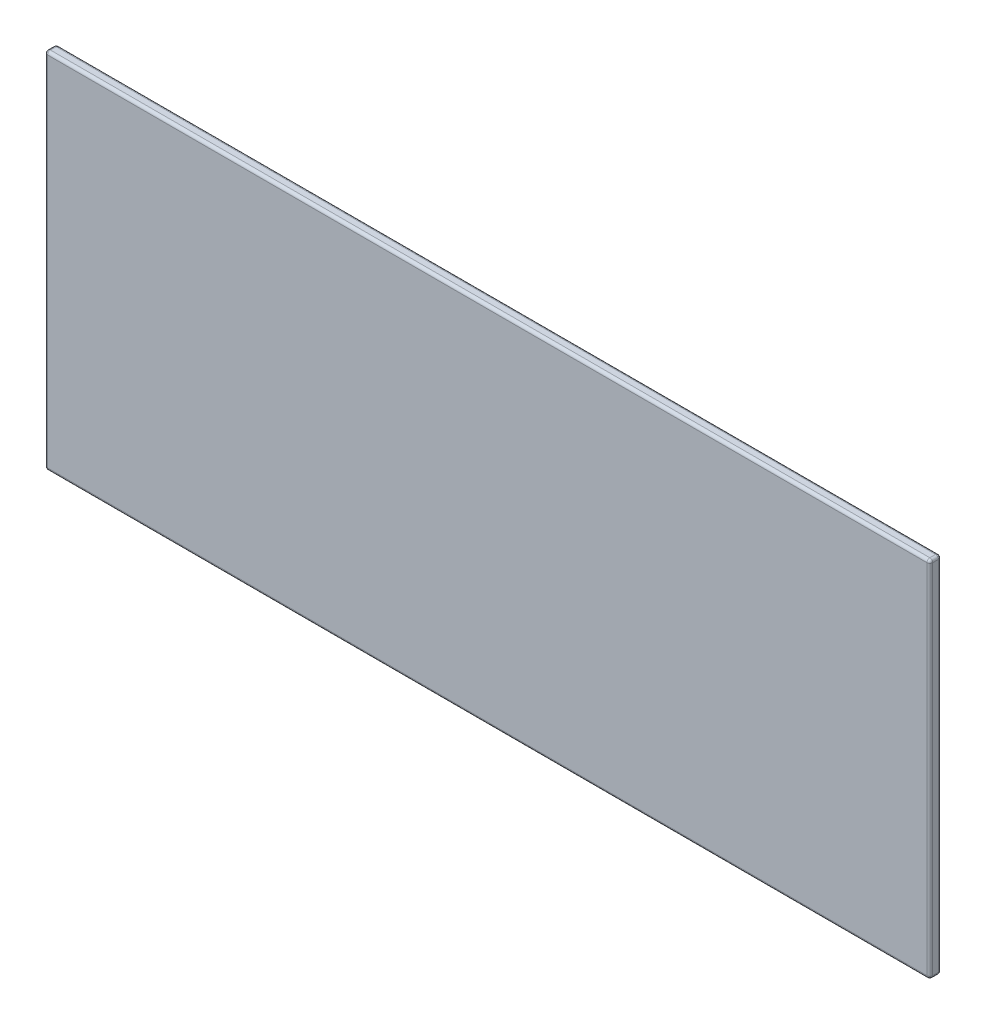
ISO-10303-21;
HEADER;
FILE_DESCRIPTION(('STEP AP214'),'2;1');
FILE_NAME('part.step','',(''),(''),'','','');
FILE_SCHEMA(('AUTOMOTIVE_DESIGN { 1 0 10303 214 1 1 1 1 }'));
ENDSEC;
DATA;
#1=APPLICATION_CONTEXT('core data for automotive mechanical design processes');
#2=APPLICATION_PROTOCOL_DEFINITION('international standard','automotive_design',2000,#1);
#3=PRODUCT_CONTEXT('',#1,'mechanical');
#4=PRODUCT('Part','Part','',(#3));
#5=PRODUCT_RELATED_PRODUCT_CATEGORY('part','',(#4));
#6=PRODUCT_DEFINITION_FORMATION('','',#4);
#7=PRODUCT_DEFINITION_CONTEXT('part definition',#1,'design');
#8=PRODUCT_DEFINITION('design','',#6,#7);
#9=PRODUCT_DEFINITION_SHAPE('','',#8);
#10=(LENGTH_UNIT() NAMED_UNIT(*) SI_UNIT(.MILLI.,.METRE.));
#11=(NAMED_UNIT(*) PLANE_ANGLE_UNIT() SI_UNIT($,.RADIAN.));
#12=(NAMED_UNIT(*) SI_UNIT($,.STERADIAN.) SOLID_ANGLE_UNIT());
#13=UNCERTAINTY_MEASURE_WITH_UNIT(LENGTH_MEASURE(1.E-05),#10,'distance_accuracy_value','');
#14=(GEOMETRIC_REPRESENTATION_CONTEXT(3) GLOBAL_UNCERTAINTY_ASSIGNED_CONTEXT((#13)) GLOBAL_UNIT_ASSIGNED_CONTEXT((#10,
#11,#12)) REPRESENTATION_CONTEXT('',''));
#15=CARTESIAN_POINT('',(0.,0.,0.));
#16=DIRECTION('',(0.,0.,1.));
#17=DIRECTION('',(1.,0.,0.));
#18=AXIS2_PLACEMENT_3D('',#15,#16,#17);
#19=CARTESIAN_POINT('',(77.35,-31.75,2.));
#20=DIRECTION('',(-1.,0.,0.));
#21=DIRECTION('',(0.,0.,1.));
#22=AXIS2_PLACEMENT_3D('',#19,#20,#21);
#23=PLANE('',#22);
#24=DIRECTION('',(0.,1.,0.));
#25=VECTOR('',#24,1.);
#26=CARTESIAN_POINT('',(77.35,-31.75,1.5));
#27=LINE('',#26,#25);
#28=CARTESIAN_POINT('',(77.35,31.25,1.5));
#29=VERTEX_POINT('',#28);
#30=CARTESIAN_POINT('',(77.35,-31.25,1.5));
#31=VERTEX_POINT('',#30);
#32=EDGE_CURVE('E42',#29,#31,#27,.F.);
#33=ORIENTED_EDGE('',*,*,#32,.T.);
#34=DIRECTION('',(0.,0.,-1.));
#35=VECTOR('',#34,1.);
#36=CARTESIAN_POINT('',(77.35,-31.25,2.));
#37=LINE('',#36,#35);
#38=CARTESIAN_POINT('',(77.35,-31.25,0.5));
#39=VERTEX_POINT('',#38);
#40=EDGE_CURVE('E11',#31,#39,#37,.T.);
#41=ORIENTED_EDGE('',*,*,#40,.T.);
#42=DIRECTION('',(0.,1.,0.));
#43=VECTOR('',#42,1.);
#44=CARTESIAN_POINT('',(77.35,31.75,0.5));
#45=LINE('',#44,#43);
#46=CARTESIAN_POINT('',(77.35,31.25,0.5));
#47=VERTEX_POINT('',#46);
#48=EDGE_CURVE('E194',#39,#47,#45,.T.);
#49=ORIENTED_EDGE('',*,*,#48,.T.);
#50=DIRECTION('',(0.,0.,-1.));
#51=VECTOR('',#50,1.);
#52=CARTESIAN_POINT('',(77.35,31.25,2.));
#53=LINE('',#52,#51);
#54=EDGE_CURVE('E53',#47,#29,#53,.F.);
#55=ORIENTED_EDGE('',*,*,#54,.T.);
#56=EDGE_LOOP('',(#33,#41,#49,#55));
#57=FACE_BOUND('',#56,.T.);
#58=ADVANCED_FACE('F33',(#57),#23,.F.);
#59=CARTESIAN_POINT('',(-77.35,31.75,2.));
#60=DIRECTION('',(0.,-1.,0.));
#61=DIRECTION('',(0.,0.,-1.));
#62=AXIS2_PLACEMENT_3D('',#59,#60,#61);
#63=PLANE('',#62);
#64=DIRECTION('',(0.,0.,-1.));
#65=VECTOR('',#64,1.);
#66=CARTESIAN_POINT('',(-76.85,31.75,2.));
#67=LINE('',#66,#65);
#68=CARTESIAN_POINT('',(-76.85,31.75,0.5));
#69=VERTEX_POINT('',#68);
#70=CARTESIAN_POINT('',(-76.85,31.75,1.5));
#71=VERTEX_POINT('',#70);
#72=EDGE_CURVE('E189',#69,#71,#67,.F.);
#73=ORIENTED_EDGE('',*,*,#72,.T.);
#74=DIRECTION('',(-1.,0.,0.));
#75=VECTOR('',#74,1.);
#76=CARTESIAN_POINT('',(-77.35,31.75,1.5));
#77=LINE('',#76,#75);
#78=CARTESIAN_POINT('',(76.85,31.75,1.5));
#79=VERTEX_POINT('',#78);
#80=EDGE_CURVE('E191',#71,#79,#77,.F.);
#81=ORIENTED_EDGE('',*,*,#80,.T.);
#82=DIRECTION('',(0.,0.,-1.));
#83=VECTOR('',#82,1.);
#84=CARTESIAN_POINT('',(76.85,31.75,2.));
#85=LINE('',#84,#83);
#86=CARTESIAN_POINT('',(76.85,31.75,0.5));
#87=VERTEX_POINT('',#86);
#88=EDGE_CURVE('E185',#79,#87,#85,.T.);
#89=ORIENTED_EDGE('',*,*,#88,.T.);
#90=DIRECTION('',(-1.,0.,0.));
#91=VECTOR('',#90,1.);
#92=CARTESIAN_POINT('',(-77.35,31.75,0.5));
#93=LINE('',#92,#91);
#94=EDGE_CURVE('E187',#87,#69,#93,.T.);
#95=ORIENTED_EDGE('',*,*,#94,.T.);
#96=EDGE_LOOP('',(#73,#81,#89,#95));
#97=FACE_BOUND('',#96,.T.);
#98=ADVANCED_FACE('F278',(#97),#63,.F.);
#99=CARTESIAN_POINT('',(-77.35,-31.75,2.));
#100=DIRECTION('',(1.,0.,0.));
#101=DIRECTION('',(0.,0.,-1.));
#102=AXIS2_PLACEMENT_3D('',#99,#100,#101);
#103=PLANE('',#102);
#104=DIRECTION('',(0.,0.,-1.));
#105=VECTOR('',#104,1.);
#106=CARTESIAN_POINT('',(-77.35,-31.25,2.));
#107=LINE('',#106,#105);
#108=CARTESIAN_POINT('',(-77.35,-31.25,0.5));
#109=VERTEX_POINT('',#108);
#110=CARTESIAN_POINT('',(-77.35,-31.25,1.5));
#111=VERTEX_POINT('',#110);
#112=EDGE_CURVE('E180',#109,#111,#107,.F.);
#113=ORIENTED_EDGE('',*,*,#112,.T.);
#114=DIRECTION('',(0.,-1.,0.));
#115=VECTOR('',#114,1.);
#116=CARTESIAN_POINT('',(-77.35,-31.75,1.5));
#117=LINE('',#116,#115);
#118=CARTESIAN_POINT('',(-77.35,31.25,1.5));
#119=VERTEX_POINT('',#118);
#120=EDGE_CURVE('E182',#111,#119,#117,.F.);
#121=ORIENTED_EDGE('',*,*,#120,.T.);
#122=DIRECTION('',(0.,0.,-1.));
#123=VECTOR('',#122,1.);
#124=CARTESIAN_POINT('',(-77.35,31.25,2.));
#125=LINE('',#124,#123);
#126=CARTESIAN_POINT('',(-77.35,31.25,0.5));
#127=VERTEX_POINT('',#126);
#128=EDGE_CURVE('E176',#119,#127,#125,.T.);
#129=ORIENTED_EDGE('',*,*,#128,.T.);
#130=DIRECTION('',(0.,-1.,0.));
#131=VECTOR('',#130,1.);
#132=CARTESIAN_POINT('',(-77.35,-31.75,0.5));
#133=LINE('',#132,#131);
#134=EDGE_CURVE('E178',#127,#109,#133,.T.);
#135=ORIENTED_EDGE('',*,*,#134,.T.);
#136=EDGE_LOOP('',(#113,#121,#129,#135));
#137=FACE_BOUND('',#136,.T.);
#138=ADVANCED_FACE('F269',(#137),#103,.F.);
#139=CARTESIAN_POINT('',(-77.35,-31.75,2.));
#140=DIRECTION('',(0.,1.,0.));
#141=DIRECTION('',(0.,0.,1.));
#142=AXIS2_PLACEMENT_3D('',#139,#140,#141);
#143=PLANE('',#142);
#144=DIRECTION('',(1.,0.,0.));
#145=VECTOR('',#144,1.);
#146=CARTESIAN_POINT('',(-77.35,-31.75,1.5));
#147=LINE('',#146,#145);
#148=CARTESIAN_POINT('',(76.85,-31.75,1.5));
#149=VERTEX_POINT('',#148);
#150=CARTESIAN_POINT('',(-76.85,-31.75,1.5));
#151=VERTEX_POINT('',#150);
#152=EDGE_CURVE('E129',#149,#151,#147,.F.);
#153=ORIENTED_EDGE('',*,*,#152,.T.);
#154=DIRECTION('',(0.,0.,-1.));
#155=VECTOR('',#154,1.);
#156=CARTESIAN_POINT('',(-76.85,-31.75,2.));
#157=LINE('',#156,#155);
#158=CARTESIAN_POINT('',(-76.85,-31.75,0.5));
#159=VERTEX_POINT('',#158);
#160=EDGE_CURVE('E165',#151,#159,#157,.T.);
#161=ORIENTED_EDGE('',*,*,#160,.T.);
#162=DIRECTION('',(1.,0.,0.));
#163=VECTOR('',#162,1.);
#164=CARTESIAN_POINT('',(77.35,-31.75,0.5));
#165=LINE('',#164,#163);
#166=CARTESIAN_POINT('',(76.85,-31.75,0.5));
#167=VERTEX_POINT('',#166);
#168=EDGE_CURVE('E158',#159,#167,#165,.T.);
#169=ORIENTED_EDGE('',*,*,#168,.T.);
#170=DIRECTION('',(0.,0.,-1.));
#171=VECTOR('',#170,1.);
#172=CARTESIAN_POINT('',(76.85,-31.75,2.));
#173=LINE('',#172,#171);
#174=EDGE_CURVE('E156',#167,#149,#173,.F.);
#175=ORIENTED_EDGE('',*,*,#174,.T.);
#176=EDGE_LOOP('',(#153,#161,#169,#175));
#177=FACE_BOUND('',#176,.T.);
#178=ADVANCED_FACE('F356',(#177),#143,.F.);
#179=CARTESIAN_POINT('',(0.,0.,2.));
#180=DIRECTION('',(0.,0.,-1.));
#181=DIRECTION('',(-1.,0.,0.));
#182=AXIS2_PLACEMENT_3D('',#179,#180,#181);
#183=PLANE('',#182);
#184=DIRECTION('',(0.,-1.,0.));
#185=VECTOR('',#184,1.);
#186=CARTESIAN_POINT('',(-76.85,0.,2.));
#187=LINE('',#186,#185);
#188=CARTESIAN_POINT('',(-76.85,31.25,2.));
#189=VERTEX_POINT('',#188);
#190=CARTESIAN_POINT('',(-76.85,-31.25,2.));
#191=VERTEX_POINT('',#190);
#192=EDGE_CURVE('E154',#189,#191,#187,.T.);
#193=ORIENTED_EDGE('',*,*,#192,.T.);
#194=DIRECTION('',(1.,0.,0.));
#195=VECTOR('',#194,1.);
#196=CARTESIAN_POINT('',(0.,-31.25,2.));
#197=LINE('',#196,#195);
#198=CARTESIAN_POINT('',(76.85,-31.25,2.));
#199=VERTEX_POINT('',#198);
#200=EDGE_CURVE('E127',#191,#199,#197,.T.);
#201=ORIENTED_EDGE('',*,*,#200,.T.);
#202=DIRECTION('',(0.,1.,0.));
#203=VECTOR('',#202,1.);
#204=CARTESIAN_POINT('',(76.85,0.,2.));
#205=LINE('',#204,#203);
#206=CARTESIAN_POINT('',(76.85,31.25,2.));
#207=VERTEX_POINT('',#206);
#208=EDGE_CURVE('E144',#199,#207,#205,.T.);
#209=ORIENTED_EDGE('',*,*,#208,.T.);
#210=DIRECTION('',(-1.,0.,0.));
#211=VECTOR('',#210,1.);
#212=CARTESIAN_POINT('',(0.,31.25,2.));
#213=LINE('',#212,#211);
#214=EDGE_CURVE('E150',#207,#189,#213,.T.);
#215=ORIENTED_EDGE('',*,*,#214,.T.);
#216=EDGE_LOOP('',(#193,#201,#209,#215));
#217=FACE_BOUND('',#216,.T.);
#218=ADVANCED_FACE('F152',(#217),#183,.F.);
#219=CARTESIAN_POINT('',(0.,0.,0.));
#220=DIRECTION('',(0.,0.,-1.));
#221=DIRECTION('',(-1.,0.,0.));
#222=AXIS2_PLACEMENT_3D('',#219,#220,#221);
#223=PLANE('',#222);
#224=DIRECTION('',(0.,1.,0.));
#225=VECTOR('',#224,1.);
#226=CARTESIAN_POINT('',(76.85,-31.75,0.));
#227=LINE('',#226,#225);
#228=CARTESIAN_POINT('',(76.85,31.25,0.));
#229=VERTEX_POINT('',#228);
#230=CARTESIAN_POINT('',(76.85,-31.25,0.));
#231=VERTEX_POINT('',#230);
#232=EDGE_CURVE('E167',#229,#231,#227,.F.);
#233=ORIENTED_EDGE('',*,*,#232,.T.);
#234=DIRECTION('',(1.,0.,0.));
#235=VECTOR('',#234,1.);
#236=CARTESIAN_POINT('',(-77.35,-31.25,0.));
#237=LINE('',#236,#235);
#238=CARTESIAN_POINT('',(-76.85,-31.25,0.));
#239=VERTEX_POINT('',#238);
#240=EDGE_CURVE('E173',#231,#239,#237,.F.);
#241=ORIENTED_EDGE('',*,*,#240,.T.);
#242=DIRECTION('',(0.,-1.,0.));
#243=VECTOR('',#242,1.);
#244=CARTESIAN_POINT('',(-76.85,31.75,0.));
#245=LINE('',#244,#243);
#246=CARTESIAN_POINT('',(-76.85,31.25,0.));
#247=VERTEX_POINT('',#246);
#248=EDGE_CURVE('E171',#239,#247,#245,.F.);
#249=ORIENTED_EDGE('',*,*,#248,.T.);
#250=DIRECTION('',(-1.,0.,0.));
#251=VECTOR('',#250,1.);
#252=CARTESIAN_POINT('',(77.35,31.25,0.));
#253=LINE('',#252,#251);
#254=EDGE_CURVE('E169',#247,#229,#253,.F.);
#255=ORIENTED_EDGE('',*,*,#254,.T.);
#256=EDGE_LOOP('',(#233,#241,#249,#255));
#257=FACE_BOUND('',#256,.T.);
#258=ADVANCED_FACE('F296',(#257),#223,.T.);
#259=CARTESIAN_POINT('',(-77.35,31.25,0.5));
#260=DIRECTION('',(1.,0.,0.));
#261=DIRECTION('',(0.,0.,-1.));
#262=AXIS2_PLACEMENT_3D('',#259,#260,#261);
#263=CYLINDRICAL_SURFACE('',#262,0.5);
#264=CARTESIAN_POINT('',(-76.85,31.25,0.5));
#265=DIRECTION('',(-1.,0.,0.));
#266=DIRECTION('',(0.,0.,1.));
#267=AXIS2_PLACEMENT_3D('',#264,#265,#266);
#268=CIRCLE('',#267,0.5);
#269=EDGE_CURVE('E37',#69,#247,#268,.T.);
#270=ORIENTED_EDGE('',*,*,#269,.F.);
#271=ORIENTED_EDGE('',*,*,#94,.F.);
#272=CARTESIAN_POINT('',(76.85,31.25,0.5));
#273=DIRECTION('',(1.,0.,0.));
#274=DIRECTION('',(0.,0.,-1.));
#275=AXIS2_PLACEMENT_3D('',#272,#273,#274);
#276=CIRCLE('',#275,0.5);
#277=EDGE_CURVE('E246',#229,#87,#276,.T.);
#278=ORIENTED_EDGE('',*,*,#277,.F.);
#279=ORIENTED_EDGE('',*,*,#254,.F.);
#280=EDGE_LOOP('',(#270,#271,#278,#279));
#281=FACE_BOUND('',#280,.T.);
#282=ADVANCED_FACE('F35',(#281),#263,.T.);
#283=CARTESIAN_POINT('',(-76.85,31.25,0.5));
#284=DIRECTION('',(0.,0.,1.));
#285=DIRECTION('',(1.,0.,0.));
#286=AXIS2_PLACEMENT_3D('',#283,#284,#285);
#287=SPHERICAL_SURFACE('',#286,0.5);
#288=CARTESIAN_POINT('',(-76.85,31.25,0.5));
#289=DIRECTION('',(0.,0.,-1.));
#290=DIRECTION('',(-1.,0.,0.));
#291=AXIS2_PLACEMENT_3D('',#288,#289,#290);
#292=CIRCLE('',#291,0.5);
#293=EDGE_CURVE('E241',#69,#127,#292,.F.);
#294=ORIENTED_EDGE('',*,*,#293,.F.);
#295=ORIENTED_EDGE('',*,*,#269,.T.);
#296=CARTESIAN_POINT('',(-76.85,31.25,0.5));
#297=DIRECTION('',(0.,1.,0.));
#298=DIRECTION('',(0.,0.,1.));
#299=AXIS2_PLACEMENT_3D('',#296,#297,#298);
#300=CIRCLE('',#299,0.5);
#301=EDGE_CURVE('E244',#127,#247,#300,.F.);
#302=ORIENTED_EDGE('',*,*,#301,.F.);
#303=EDGE_LOOP('',(#294,#295,#302));
#304=FACE_BOUND('',#303,.T.);
#305=ADVANCED_FACE('F257',(#304),#287,.T.);
#306=CARTESIAN_POINT('',(76.85,31.25,0.5));
#307=DIRECTION('',(0.,0.,1.));
#308=DIRECTION('',(1.,0.,0.));
#309=AXIS2_PLACEMENT_3D('',#306,#307,#308);
#310=SPHERICAL_SURFACE('',#309,0.5);
#311=CARTESIAN_POINT('',(76.85,31.25,0.5));
#312=DIRECTION('',(0.,1.,0.));
#313=DIRECTION('',(0.,0.,1.));
#314=AXIS2_PLACEMENT_3D('',#311,#312,#313);
#315=CIRCLE('',#314,0.5);
#316=EDGE_CURVE('E235',#229,#47,#315,.F.);
#317=ORIENTED_EDGE('',*,*,#316,.F.);
#318=ORIENTED_EDGE('',*,*,#277,.T.);
#319=CARTESIAN_POINT('',(76.85,31.25,0.5));
#320=DIRECTION('',(0.,0.,-1.));
#321=DIRECTION('',(-1.,0.,0.));
#322=AXIS2_PLACEMENT_3D('',#319,#320,#321);
#323=CIRCLE('',#322,0.5);
#324=EDGE_CURVE('E238',#47,#87,#323,.F.);
#325=ORIENTED_EDGE('',*,*,#324,.F.);
#326=EDGE_LOOP('',(#317,#318,#325));
#327=FACE_BOUND('',#326,.T.);
#328=ADVANCED_FACE('F289',(#327),#310,.T.);
#329=CARTESIAN_POINT('',(-76.85,-31.75,0.5));
#330=DIRECTION('',(0.,1.,0.));
#331=DIRECTION('',(0.,0.,1.));
#332=AXIS2_PLACEMENT_3D('',#329,#330,#331);
#333=CYLINDRICAL_SURFACE('',#332,0.5);
#334=ORIENTED_EDGE('',*,*,#301,.T.);
#335=ORIENTED_EDGE('',*,*,#248,.F.);
#336=CARTESIAN_POINT('',(-76.85,-31.25,0.5));
#337=DIRECTION('',(0.,-1.,0.));
#338=DIRECTION('',(0.,0.,-1.));
#339=AXIS2_PLACEMENT_3D('',#336,#337,#338);
#340=CIRCLE('',#339,0.5);
#341=EDGE_CURVE('E230',#109,#239,#340,.T.);
#342=ORIENTED_EDGE('',*,*,#341,.F.);
#343=ORIENTED_EDGE('',*,*,#134,.F.);
#344=EDGE_LOOP('',(#334,#335,#342,#343));
#345=FACE_BOUND('',#344,.T.);
#346=ADVANCED_FACE('F265',(#345),#333,.T.);
#347=CARTESIAN_POINT('',(-76.85,31.25,2.));
#348=DIRECTION('',(0.,0.,-1.));
#349=DIRECTION('',(-1.,0.,0.));
#350=AXIS2_PLACEMENT_3D('',#347,#348,#349);
#351=CYLINDRICAL_SURFACE('',#350,0.5);
#352=ORIENTED_EDGE('',*,*,#293,.T.);
#353=ORIENTED_EDGE('',*,*,#128,.F.);
#354=CARTESIAN_POINT('',(-76.85,31.25,1.5));
#355=DIRECTION('',(0.,0.,1.));
#356=DIRECTION('',(1.,0.,0.));
#357=AXIS2_PLACEMENT_3D('',#354,#355,#356);
#358=CIRCLE('',#357,0.5);
#359=EDGE_CURVE('E227',#71,#119,#358,.T.);
#360=ORIENTED_EDGE('',*,*,#359,.F.);
#361=ORIENTED_EDGE('',*,*,#72,.F.);
#362=EDGE_LOOP('',(#352,#353,#360,#361));
#363=FACE_BOUND('',#362,.T.);
#364=ADVANCED_FACE('F275',(#363),#351,.T.);
#365=CARTESIAN_POINT('',(0.,31.25,1.5));
#366=DIRECTION('',(-1.,0.,0.));
#367=DIRECTION('',(0.,0.,1.));
#368=AXIS2_PLACEMENT_3D('',#365,#366,#367);
#369=CYLINDRICAL_SURFACE('',#368,0.5);
#370=CARTESIAN_POINT('',(76.85,31.25,1.5));
#371=DIRECTION('',(1.,0.,0.));
#372=DIRECTION('',(0.,0.,-1.));
#373=AXIS2_PLACEMENT_3D('',#370,#371,#372);
#374=CIRCLE('',#373,0.5);
#375=EDGE_CURVE('E221',#79,#207,#374,.T.);
#376=ORIENTED_EDGE('',*,*,#375,.F.);
#377=ORIENTED_EDGE('',*,*,#80,.F.);
#378=CARTESIAN_POINT('',(-76.85,31.25,1.5));
#379=DIRECTION('',(-1.,0.,0.));
#380=DIRECTION('',(0.,0.,1.));
#381=AXIS2_PLACEMENT_3D('',#378,#379,#380);
#382=CIRCLE('',#381,0.5);
#383=EDGE_CURVE('E224',#189,#71,#382,.T.);
#384=ORIENTED_EDGE('',*,*,#383,.F.);
#385=ORIENTED_EDGE('',*,*,#214,.F.);
#386=EDGE_LOOP('',(#376,#377,#384,#385));
#387=FACE_BOUND('',#386,.T.);
#388=ADVANCED_FACE('F282',(#387),#369,.T.);
#389=CARTESIAN_POINT('',(76.85,31.25,2.));
#390=DIRECTION('',(0.,0.,-1.));
#391=DIRECTION('',(-1.,0.,0.));
#392=AXIS2_PLACEMENT_3D('',#389,#390,#391);
#393=CYLINDRICAL_SURFACE('',#392,0.5);
#394=ORIENTED_EDGE('',*,*,#324,.T.);
#395=ORIENTED_EDGE('',*,*,#88,.F.);
#396=CARTESIAN_POINT('',(76.85,31.25,1.5));
#397=DIRECTION('',(0.,0.,1.));
#398=DIRECTION('',(1.,0.,0.));
#399=AXIS2_PLACEMENT_3D('',#396,#397,#398);
#400=CIRCLE('',#399,0.5);
#401=EDGE_CURVE('E219',#29,#79,#400,.T.);
#402=ORIENTED_EDGE('',*,*,#401,.F.);
#403=ORIENTED_EDGE('',*,*,#54,.F.);
#404=EDGE_LOOP('',(#394,#395,#402,#403));
#405=FACE_BOUND('',#404,.T.);
#406=ADVANCED_FACE('F287',(#405),#393,.T.);
#407=CARTESIAN_POINT('',(76.85,-31.75,0.5));
#408=DIRECTION('',(0.,-1.,0.));
#409=DIRECTION('',(0.,0.,-1.));
#410=AXIS2_PLACEMENT_3D('',#407,#408,#409);
#411=CYLINDRICAL_SURFACE('',#410,0.5);
#412=ORIENTED_EDGE('',*,*,#316,.T.);
#413=ORIENTED_EDGE('',*,*,#48,.F.);
#414=CARTESIAN_POINT('',(76.85,-31.25,0.5));
#415=DIRECTION('',(0.,-1.,0.));
#416=DIRECTION('',(0.,0.,-1.));
#417=AXIS2_PLACEMENT_3D('',#414,#415,#416);
#418=CIRCLE('',#417,0.5);
#419=EDGE_CURVE('E216',#231,#39,#418,.T.);
#420=ORIENTED_EDGE('',*,*,#419,.F.);
#421=ORIENTED_EDGE('',*,*,#232,.F.);
#422=EDGE_LOOP('',(#412,#413,#420,#421));
#423=FACE_BOUND('',#422,.T.);
#424=ADVANCED_FACE('F293',(#423),#411,.T.);
#425=CARTESIAN_POINT('',(-77.35,-31.25,0.5));
#426=DIRECTION('',(-1.,0.,0.));
#427=DIRECTION('',(0.,0.,1.));
#428=AXIS2_PLACEMENT_3D('',#425,#426,#427);
#429=CYLINDRICAL_SURFACE('',#428,0.5);
#430=CARTESIAN_POINT('',(-76.85,-31.25,0.5));
#431=DIRECTION('',(-1.,0.,0.));
#432=DIRECTION('',(0.,0.,1.));
#433=AXIS2_PLACEMENT_3D('',#430,#431,#432);
#434=CIRCLE('',#433,0.5);
#435=EDGE_CURVE('E232',#239,#159,#434,.T.);
#436=ORIENTED_EDGE('',*,*,#435,.F.);
#437=ORIENTED_EDGE('',*,*,#240,.F.);
#438=CARTESIAN_POINT('',(76.85,-31.25,0.5));
#439=DIRECTION('',(1.,0.,0.));
#440=DIRECTION('',(0.,0.,-1.));
#441=AXIS2_PLACEMENT_3D('',#438,#439,#440);
#442=CIRCLE('',#441,0.5);
#443=EDGE_CURVE('E213',#167,#231,#442,.T.);
#444=ORIENTED_EDGE('',*,*,#443,.F.);
#445=ORIENTED_EDGE('',*,*,#168,.F.);
#446=EDGE_LOOP('',(#436,#437,#444,#445));
#447=FACE_BOUND('',#446,.T.);
#448=ADVANCED_FACE('F300',(#447),#429,.T.);
#449=CARTESIAN_POINT('',(-76.85,-31.25,0.5));
#450=DIRECTION('',(0.,0.,1.));
#451=DIRECTION('',(1.,0.,0.));
#452=AXIS2_PLACEMENT_3D('',#449,#450,#451);
#453=SPHERICAL_SURFACE('',#452,0.5);
#454=ORIENTED_EDGE('',*,*,#341,.T.);
#455=ORIENTED_EDGE('',*,*,#435,.T.);
#456=CARTESIAN_POINT('',(-76.85,-31.25,0.5));
#457=DIRECTION('',(0.,0.,-1.));
#458=DIRECTION('',(-1.,0.,0.));
#459=AXIS2_PLACEMENT_3D('',#456,#457,#458);
#460=CIRCLE('',#459,0.5);
#461=EDGE_CURVE('E210',#109,#159,#460,.F.);
#462=ORIENTED_EDGE('',*,*,#461,.F.);
#463=EDGE_LOOP('',(#454,#455,#462));
#464=FACE_BOUND('',#463,.T.);
#465=ADVANCED_FACE('F304',(#464),#453,.T.);
#466=CARTESIAN_POINT('',(-76.85,31.25,1.5));
#467=DIRECTION('',(0.,0.,1.));
#468=DIRECTION('',(1.,0.,0.));
#469=AXIS2_PLACEMENT_3D('',#466,#467,#468);
#470=SPHERICAL_SURFACE('',#469,0.5);
#471=ORIENTED_EDGE('',*,*,#383,.T.);
#472=ORIENTED_EDGE('',*,*,#359,.T.);
#473=CARTESIAN_POINT('',(-76.85,31.25,1.5));
#474=DIRECTION('',(0.,1.,0.));
#475=DIRECTION('',(0.,0.,1.));
#476=AXIS2_PLACEMENT_3D('',#473,#474,#475);
#477=CIRCLE('',#476,0.5);
#478=EDGE_CURVE('E208',#189,#119,#477,.F.);
#479=ORIENTED_EDGE('',*,*,#478,.F.);
#480=EDGE_LOOP('',(#471,#472,#479));
#481=FACE_BOUND('',#480,.T.);
#482=ADVANCED_FACE('F315',(#481),#470,.T.);
#483=CARTESIAN_POINT('',(76.85,31.25,1.5));
#484=DIRECTION('',(0.,0.,1.));
#485=DIRECTION('',(1.,0.,0.));
#486=AXIS2_PLACEMENT_3D('',#483,#484,#485);
#487=SPHERICAL_SURFACE('',#486,0.5);
#488=ORIENTED_EDGE('',*,*,#401,.T.);
#489=ORIENTED_EDGE('',*,*,#375,.T.);
#490=CARTESIAN_POINT('',(76.85,31.25,1.5));
#491=DIRECTION('',(0.,1.,0.));
#492=DIRECTION('',(0.,0.,1.));
#493=AXIS2_PLACEMENT_3D('',#490,#491,#492);
#494=CIRCLE('',#493,0.5);
#495=EDGE_CURVE('E147',#29,#207,#494,.F.);
#496=ORIENTED_EDGE('',*,*,#495,.F.);
#497=EDGE_LOOP('',(#488,#489,#496));
#498=FACE_BOUND('',#497,.T.);
#499=ADVANCED_FACE('F317',(#498),#487,.T.);
#500=CARTESIAN_POINT('',(76.85,-31.25,0.5));
#501=DIRECTION('',(0.,0.,1.));
#502=DIRECTION('',(1.,0.,0.));
#503=AXIS2_PLACEMENT_3D('',#500,#501,#502);
#504=SPHERICAL_SURFACE('',#503,0.5);
#505=ORIENTED_EDGE('',*,*,#443,.T.);
#506=ORIENTED_EDGE('',*,*,#419,.T.);
#507=CARTESIAN_POINT('',(76.85,-31.25,0.5));
#508=DIRECTION('',(0.,0.,-1.));
#509=DIRECTION('',(-1.,0.,0.));
#510=AXIS2_PLACEMENT_3D('',#507,#508,#509);
#511=CIRCLE('',#510,0.5);
#512=EDGE_CURVE('E205',#167,#39,#511,.F.);
#513=ORIENTED_EDGE('',*,*,#512,.F.);
#514=EDGE_LOOP('',(#505,#506,#513));
#515=FACE_BOUND('',#514,.T.);
#516=ADVANCED_FACE('F323',(#515),#504,.T.);
#517=CARTESIAN_POINT('',(-76.85,-31.25,2.));
#518=DIRECTION('',(0.,0.,-1.));
#519=DIRECTION('',(-1.,0.,0.));
#520=AXIS2_PLACEMENT_3D('',#517,#518,#519);
#521=CYLINDRICAL_SURFACE('',#520,0.5);
#522=ORIENTED_EDGE('',*,*,#461,.T.);
#523=ORIENTED_EDGE('',*,*,#160,.F.);
#524=CARTESIAN_POINT('',(-76.85,-31.25,1.5));
#525=DIRECTION('',(0.,0.,1.));
#526=DIRECTION('',(1.,0.,0.));
#527=AXIS2_PLACEMENT_3D('',#524,#525,#526);
#528=CIRCLE('',#527,0.5);
#529=EDGE_CURVE('E202',#111,#151,#528,.T.);
#530=ORIENTED_EDGE('',*,*,#529,.F.);
#531=ORIENTED_EDGE('',*,*,#112,.F.);
#532=EDGE_LOOP('',(#522,#523,#530,#531));
#533=FACE_BOUND('',#532,.T.);
#534=ADVANCED_FACE('F307',(#533),#521,.T.);
#535=CARTESIAN_POINT('',(-76.85,0.,1.5));
#536=DIRECTION('',(0.,-1.,0.));
#537=DIRECTION('',(0.,0.,-1.));
#538=AXIS2_PLACEMENT_3D('',#535,#536,#537);
#539=CYLINDRICAL_SURFACE('',#538,0.5);
#540=ORIENTED_EDGE('',*,*,#478,.T.);
#541=ORIENTED_EDGE('',*,*,#120,.F.);
#542=CARTESIAN_POINT('',(-76.85,-31.25,1.5));
#543=DIRECTION('',(0.,-1.,0.));
#544=DIRECTION('',(0.,0.,-1.));
#545=AXIS2_PLACEMENT_3D('',#542,#543,#544);
#546=CIRCLE('',#545,0.5);
#547=EDGE_CURVE('E141',#191,#111,#546,.T.);
#548=ORIENTED_EDGE('',*,*,#547,.F.);
#549=ORIENTED_EDGE('',*,*,#192,.F.);
#550=EDGE_LOOP('',(#540,#541,#548,#549));
#551=FACE_BOUND('',#550,.T.);
#552=ADVANCED_FACE('F313',(#551),#539,.T.);
#553=CARTESIAN_POINT('',(76.85,0.,1.5));
#554=DIRECTION('',(0.,1.,0.));
#555=DIRECTION('',(0.,0.,1.));
#556=AXIS2_PLACEMENT_3D('',#553,#554,#555);
#557=CYLINDRICAL_SURFACE('',#556,0.5);
#558=ORIENTED_EDGE('',*,*,#495,.T.);
#559=ORIENTED_EDGE('',*,*,#208,.F.);
#560=CARTESIAN_POINT('',(76.85,-31.25,1.5));
#561=DIRECTION('',(0.,-1.,0.));
#562=DIRECTION('',(0.,0.,-1.));
#563=AXIS2_PLACEMENT_3D('',#560,#561,#562);
#564=CIRCLE('',#563,0.5);
#565=EDGE_CURVE('E135',#31,#199,#564,.T.);
#566=ORIENTED_EDGE('',*,*,#565,.F.);
#567=ORIENTED_EDGE('',*,*,#32,.F.);
#568=EDGE_LOOP('',(#558,#559,#566,#567));
#569=FACE_BOUND('',#568,.T.);
#570=ADVANCED_FACE('F145',(#569),#557,.T.);
#571=CARTESIAN_POINT('',(76.85,-31.25,2.));
#572=DIRECTION('',(0.,0.,-1.));
#573=DIRECTION('',(-1.,0.,0.));
#574=AXIS2_PLACEMENT_3D('',#571,#572,#573);
#575=CYLINDRICAL_SURFACE('',#574,0.5);
#576=ORIENTED_EDGE('',*,*,#512,.T.);
#577=ORIENTED_EDGE('',*,*,#40,.F.);
#578=CARTESIAN_POINT('',(76.85,-31.25,1.5));
#579=DIRECTION('',(0.,0.,1.));
#580=DIRECTION('',(1.,0.,0.));
#581=AXIS2_PLACEMENT_3D('',#578,#579,#580);
#582=CIRCLE('',#581,0.5);
#583=EDGE_CURVE('E139',#149,#31,#582,.T.);
#584=ORIENTED_EDGE('',*,*,#583,.F.);
#585=ORIENTED_EDGE('',*,*,#174,.F.);
#586=EDGE_LOOP('',(#576,#577,#584,#585));
#587=FACE_BOUND('',#586,.T.);
#588=ADVANCED_FACE('F340',(#587),#575,.T.);
#589=CARTESIAN_POINT('',(-76.85,-31.25,1.5));
#590=DIRECTION('',(0.,0.,1.));
#591=DIRECTION('',(1.,0.,0.));
#592=AXIS2_PLACEMENT_3D('',#589,#590,#591);
#593=SPHERICAL_SURFACE('',#592,0.5);
#594=ORIENTED_EDGE('',*,*,#547,.T.);
#595=ORIENTED_EDGE('',*,*,#529,.T.);
#596=CARTESIAN_POINT('',(-76.85,-31.25,1.5));
#597=DIRECTION('',(-1.,0.,0.));
#598=DIRECTION('',(0.,0.,1.));
#599=AXIS2_PLACEMENT_3D('',#596,#597,#598);
#600=CIRCLE('',#599,0.5);
#601=EDGE_CURVE('E132',#191,#151,#600,.F.);
#602=ORIENTED_EDGE('',*,*,#601,.F.);
#603=EDGE_LOOP('',(#594,#595,#602));
#604=FACE_BOUND('',#603,.T.);
#605=ADVANCED_FACE('F311',(#604),#593,.T.);
#606=CARTESIAN_POINT('',(76.85,-31.25,1.5));
#607=DIRECTION('',(0.,0.,1.));
#608=DIRECTION('',(1.,0.,0.));
#609=AXIS2_PLACEMENT_3D('',#606,#607,#608);
#610=SPHERICAL_SURFACE('',#609,0.5);
#611=ORIENTED_EDGE('',*,*,#583,.T.);
#612=ORIENTED_EDGE('',*,*,#565,.T.);
#613=CARTESIAN_POINT('',(76.85,-31.25,1.5));
#614=DIRECTION('',(1.,0.,0.));
#615=DIRECTION('',(0.,0.,-1.));
#616=AXIS2_PLACEMENT_3D('',#613,#614,#615);
#617=CIRCLE('',#616,0.5);
#618=EDGE_CURVE('E123',#149,#199,#617,.F.);
#619=ORIENTED_EDGE('',*,*,#618,.F.);
#620=EDGE_LOOP('',(#611,#612,#619));
#621=FACE_BOUND('',#620,.T.);
#622=ADVANCED_FACE('F137',(#621),#610,.T.);
#623=CARTESIAN_POINT('',(0.,-31.25,1.5));
#624=DIRECTION('',(1.,0.,0.));
#625=DIRECTION('',(0.,0.,-1.));
#626=AXIS2_PLACEMENT_3D('',#623,#624,#625);
#627=CYLINDRICAL_SURFACE('',#626,0.5);
#628=ORIENTED_EDGE('',*,*,#601,.T.);
#629=ORIENTED_EDGE('',*,*,#152,.F.);
#630=ORIENTED_EDGE('',*,*,#618,.T.);
#631=ORIENTED_EDGE('',*,*,#200,.F.);
#632=EDGE_LOOP('',(#628,#629,#630,#631));
#633=FACE_BOUND('',#632,.T.);
#634=ADVANCED_FACE('F125',(#633),#627,.T.);
#635=CLOSED_SHELL('',(#58,#98,#138,#178,#218,#258,#282,#305,#328,#346,#364,#388,#406,#424,#448,
#465,#482,#499,#516,#534,#552,#570,#588,#605,#622,#634));
#636=MANIFOLD_SOLID_BREP('B2',#635);
#637=ADVANCED_BREP_SHAPE_REPRESENTATION('',(#18,#636),#14);
#638=SHAPE_DEFINITION_REPRESENTATION(#9,#637);
ENDSEC;
END-ISO-10303-21;
